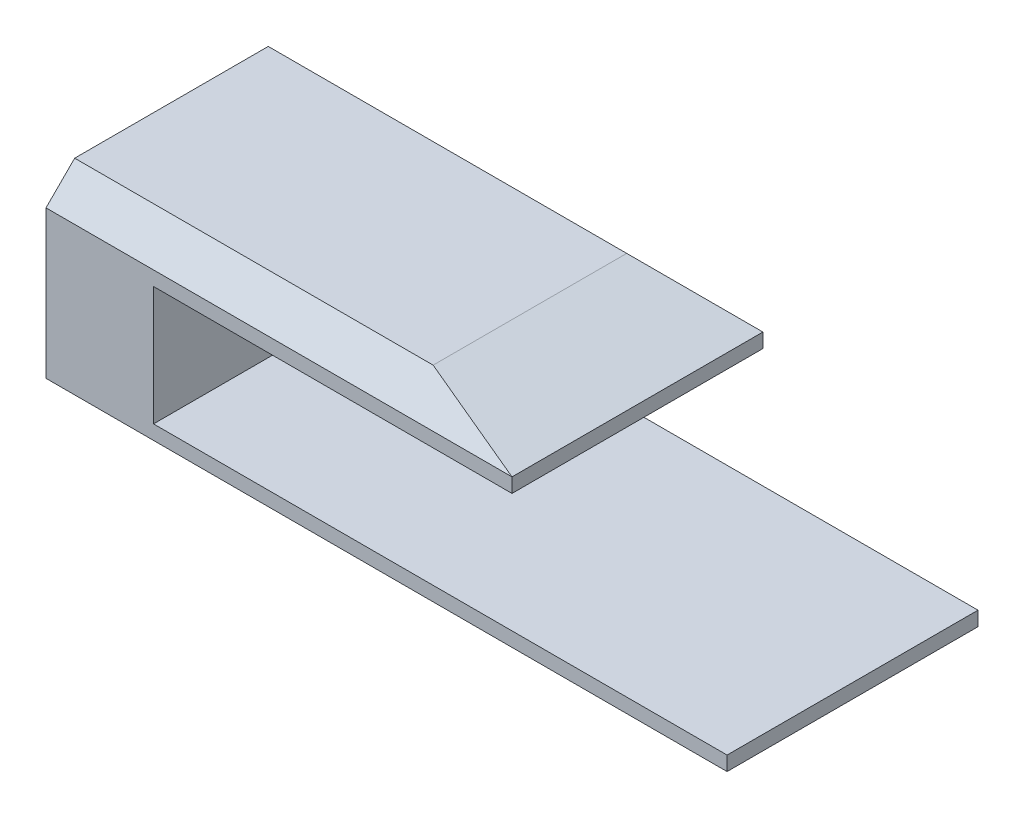
ISO-10303-21;
HEADER;
FILE_DESCRIPTION(('STEP AP214'),'2;1');
FILE_NAME('part.step','',(''),(''),'','','');
FILE_SCHEMA(('AUTOMOTIVE_DESIGN { 1 0 10303 214 1 1 1 1 }'));
ENDSEC;
DATA;
#1=APPLICATION_CONTEXT('core data for automotive mechanical design processes');
#2=APPLICATION_PROTOCOL_DEFINITION('international standard','automotive_design',2000,#1);
#3=PRODUCT_CONTEXT('',#1,'mechanical');
#4=PRODUCT('Part','Part','',(#3));
#5=PRODUCT_RELATED_PRODUCT_CATEGORY('part','',(#4));
#6=PRODUCT_DEFINITION_FORMATION('','',#4);
#7=PRODUCT_DEFINITION_CONTEXT('part definition',#1,'design');
#8=PRODUCT_DEFINITION('design','',#6,#7);
#9=PRODUCT_DEFINITION_SHAPE('','',#8);
#10=(LENGTH_UNIT() NAMED_UNIT(*) SI_UNIT(.MILLI.,.METRE.));
#11=(NAMED_UNIT(*) PLANE_ANGLE_UNIT() SI_UNIT($,.RADIAN.));
#12=(NAMED_UNIT(*) SI_UNIT($,.STERADIAN.) SOLID_ANGLE_UNIT());
#13=UNCERTAINTY_MEASURE_WITH_UNIT(LENGTH_MEASURE(1.E-05),#10,'distance_accuracy_value','');
#14=(GEOMETRIC_REPRESENTATION_CONTEXT(3) GLOBAL_UNCERTAINTY_ASSIGNED_CONTEXT((#13)) GLOBAL_UNIT_ASSIGNED_CONTEXT((#10,
#11,#12)) REPRESENTATION_CONTEXT('',''));
#15=CARTESIAN_POINT('',(0.,0.,0.));
#16=DIRECTION('',(0.,0.,1.));
#17=DIRECTION('',(1.,0.,0.));
#18=AXIS2_PLACEMENT_3D('',#15,#16,#17);
#19=CARTESIAN_POINT('',(0.,-28.6,35.));
#20=DIRECTION('',(1.,0.,0.));
#21=DIRECTION('',(0.,0.,-1.));
#22=AXIS2_PLACEMENT_3D('',#19,#20,#21);
#23=PLANE('',#22);
#24=DIRECTION('',(0.,-0.707106781186548,0.707106781186547));
#25=VECTOR('',#24,1.);
#26=CARTESIAN_POINT('',(0.,-14.3,6.89339828220179));
#27=LINE('',#26,#25);
#28=CARTESIAN_POINT('',(0.,-14.3,6.89339828220179));
#29=VERTEX_POINT('',#28);
#30=CARTESIAN_POINT('',(0.,-24.9066017177982,17.5));
#31=VERTEX_POINT('',#30);
#32=EDGE_CURVE('E181',#29,#31,#27,.T.);
#33=ORIENTED_EDGE('',*,*,#32,.F.);
#34=DIRECTION('',(0.,-0.707106781186547,-0.707106781186548));
#35=VECTOR('',#34,1.);
#36=CARTESIAN_POINT('',(0.,-3.69339828220179,17.5));
#37=LINE('',#36,#35);
#38=CARTESIAN_POINT('',(0.,-3.69339828220179,17.5));
#39=VERTEX_POINT('',#38);
#40=EDGE_CURVE('E155',#39,#29,#37,.T.);
#41=ORIENTED_EDGE('',*,*,#40,.F.);
#42=DIRECTION('',(0.,0.707106781186548,-0.707106781186548));
#43=VECTOR('',#42,1.);
#44=CARTESIAN_POINT('',(0.,-14.3,28.1066017177982));
#45=LINE('',#44,#43);
#46=CARTESIAN_POINT('',(0.,-14.3,28.1066017177982));
#47=VERTEX_POINT('',#46);
#48=EDGE_CURVE('E172',#47,#39,#45,.T.);
#49=ORIENTED_EDGE('',*,*,#48,.F.);
#50=DIRECTION('',(0.,0.707106781186547,0.707106781186547));
#51=VECTOR('',#50,1.);
#52=CARTESIAN_POINT('',(0.,-24.9066017177982,17.5));
#53=LINE('',#52,#51);
#54=EDGE_CURVE('E175',#31,#47,#53,.T.);
#55=ORIENTED_EDGE('',*,*,#54,.F.);
#56=EDGE_LOOP('',(#33,#41,#49,#55));
#57=FACE_BOUND('',#56,.T.);
#58=DIRECTION('',(0.,0.,-1.));
#59=VECTOR('',#58,1.);
#60=CARTESIAN_POINT('',(0.,-28.6,35.));
#61=LINE('',#60,#59);
#62=CARTESIAN_POINT('',(0.,-28.6,31.));
#63=VERTEX_POINT('',#62);
#64=CARTESIAN_POINT('',(0.,-28.6,4.00000000000002));
#65=VERTEX_POINT('',#64);
#66=EDGE_CURVE('E234',#63,#65,#61,.T.);
#67=ORIENTED_EDGE('',*,*,#66,.F.);
#68=DIRECTION('',(0.,-0.707106781186548,-0.707106781186548));
#69=VECTOR('',#68,1.);
#70=CARTESIAN_POINT('',(0.,-24.6,35.));
#71=LINE('',#70,#69);
#72=CARTESIAN_POINT('',(0.,-24.6,35.));
#73=VERTEX_POINT('',#72);
#74=EDGE_CURVE('E261',#63,#73,#71,.F.);
#75=ORIENTED_EDGE('',*,*,#74,.T.);
#76=DIRECTION('',(0.,-1.,0.));
#77=VECTOR('',#76,1.);
#78=CARTESIAN_POINT('',(0.,-28.6,35.));
#79=LINE('',#78,#77);
#80=CARTESIAN_POINT('',(0.,-4.00000000000002,35.));
#81=VERTEX_POINT('',#80);
#82=EDGE_CURVE('E192',#81,#73,#79,.T.);
#83=ORIENTED_EDGE('',*,*,#82,.F.);
#84=DIRECTION('',(0.,-0.707106781186548,0.707106781186548));
#85=VECTOR('',#84,1.);
#86=CARTESIAN_POINT('',(0.,-4.00000000000002,35.));
#87=LINE('',#86,#85);
#88=CARTESIAN_POINT('',(0.,0.,31.));
#89=VERTEX_POINT('',#88);
#90=EDGE_CURVE('E257',#81,#89,#87,.F.);
#91=ORIENTED_EDGE('',*,*,#90,.T.);
#92=DIRECTION('',(0.,0.,-1.));
#93=VECTOR('',#92,1.);
#94=CARTESIAN_POINT('',(0.,0.,35.));
#95=LINE('',#94,#93);
#96=CARTESIAN_POINT('',(0.,0.,4.00000000000002));
#97=VERTEX_POINT('',#96);
#98=EDGE_CURVE('E207',#89,#97,#95,.T.);
#99=ORIENTED_EDGE('',*,*,#98,.T.);
#100=DIRECTION('',(0.,-0.707106781186548,-0.707106781186548));
#101=VECTOR('',#100,1.);
#102=CARTESIAN_POINT('',(0.,0.,4.00000000000002));
#103=LINE('',#102,#101);
#104=CARTESIAN_POINT('',(0.,-4.00000000000002,0.));
#105=VERTEX_POINT('',#104);
#106=EDGE_CURVE('E255',#97,#105,#103,.T.);
#107=ORIENTED_EDGE('',*,*,#106,.T.);
#108=DIRECTION('',(0.,-1.,0.));
#109=VECTOR('',#108,1.);
#110=CARTESIAN_POINT('',(0.,-28.6,0.));
#111=LINE('',#110,#109);
#112=CARTESIAN_POINT('',(0.,-24.6,0.));
#113=VERTEX_POINT('',#112);
#114=EDGE_CURVE('E188',#105,#113,#111,.T.);
#115=ORIENTED_EDGE('',*,*,#114,.T.);
#116=DIRECTION('',(0.,-0.707106781186548,0.707106781186548));
#117=VECTOR('',#116,1.);
#118=CARTESIAN_POINT('',(0.,-28.6,4.00000000000001));
#119=LINE('',#118,#117);
#120=EDGE_CURVE('E259',#113,#65,#119,.T.);
#121=ORIENTED_EDGE('',*,*,#120,.T.);
#122=EDGE_LOOP('',(#67,#75,#83,#91,#99,#107,#115,#121));
#123=FACE_BOUND('',#122,.T.);
#124=ADVANCED_FACE('F35',(#57,#123),#23,.F.);
#125=CARTESIAN_POINT('',(95.,-28.6,35.));
#126=DIRECTION('',(0.,1.,0.));
#127=DIRECTION('',(-1.,0.,0.));
#128=AXIS2_PLACEMENT_3D('',#125,#126,#127);
#129=PLANE('',#128);
#130=DIRECTION('',(1.,0.,0.));
#131=VECTOR('',#130,1.);
#132=CARTESIAN_POINT('',(95.,-28.6,4.00000000000002));
#133=LINE('',#132,#131);
#134=CARTESIAN_POINT('',(79.9999999999998,-28.6,4.00000000000002));
#135=VERTEX_POINT('',#134);
#136=EDGE_CURVE('E251',#65,#135,#133,.T.);
#137=ORIENTED_EDGE('',*,*,#136,.T.);
#138=DIRECTION('',(0.,0.,1.));
#139=VECTOR('',#138,1.);
#140=CARTESIAN_POINT('',(79.9999999999998,-28.6,35.));
#141=LINE('',#140,#139);
#142=CARTESIAN_POINT('',(79.9999999999998,-28.6,31.));
#143=VERTEX_POINT('',#142);
#144=EDGE_CURVE('E44',#135,#143,#141,.T.);
#145=ORIENTED_EDGE('',*,*,#144,.T.);
#146=DIRECTION('',(-1.,0.,0.));
#147=VECTOR('',#146,1.);
#148=CARTESIAN_POINT('',(95.,-28.6,31.));
#149=LINE('',#148,#147);
#150=EDGE_CURVE('E253',#143,#63,#149,.T.);
#151=ORIENTED_EDGE('',*,*,#150,.T.);
#152=ORIENTED_EDGE('',*,*,#66,.T.);
#153=EDGE_LOOP('',(#137,#145,#151,#152));
#154=FACE_BOUND('',#153,.T.);
#155=ADVANCED_FACE('F303',(#154),#129,.F.);
#156=CARTESIAN_POINT('',(95.,-22.6,35.));
#157=DIRECTION('',(-1.,0.,0.));
#158=DIRECTION('',(0.,0.,1.));
#159=AXIS2_PLACEMENT_3D('',#156,#157,#158);
#160=PLANE('',#159);
#161=DIRECTION('',(0.,1.,0.));
#162=VECTOR('',#161,1.);
#163=CARTESIAN_POINT('',(95.,-22.6,35.));
#164=LINE('',#163,#162);
#165=CARTESIAN_POINT('',(95.,-24.6,35.));
#166=VERTEX_POINT('',#165);
#167=CARTESIAN_POINT('',(95.,-22.6,35.));
#168=VERTEX_POINT('',#167);
#169=EDGE_CURVE('E195',#166,#168,#164,.T.);
#170=ORIENTED_EDGE('',*,*,#169,.F.);
#171=DIRECTION('',(0.,0.,-1.));
#172=VECTOR('',#171,1.);
#173=CARTESIAN_POINT('',(95.,-24.6,35.));
#174=LINE('',#173,#172);
#175=CARTESIAN_POINT('',(95.,-24.6,0.));
#176=VERTEX_POINT('',#175);
#177=EDGE_CURVE('E282',#166,#176,#174,.T.);
#178=ORIENTED_EDGE('',*,*,#177,.T.);
#179=DIRECTION('',(0.,1.,0.));
#180=VECTOR('',#179,1.);
#181=CARTESIAN_POINT('',(95.,-22.6,0.));
#182=LINE('',#181,#180);
#183=CARTESIAN_POINT('',(95.,-22.6,0.));
#184=VERTEX_POINT('',#183);
#185=EDGE_CURVE('E210',#176,#184,#182,.T.);
#186=ORIENTED_EDGE('',*,*,#185,.T.);
#187=DIRECTION('',(0.,0.,-1.));
#188=VECTOR('',#187,1.);
#189=CARTESIAN_POINT('',(95.,-22.6,35.));
#190=LINE('',#189,#188);
#191=EDGE_CURVE('E231',#168,#184,#190,.T.);
#192=ORIENTED_EDGE('',*,*,#191,.F.);
#193=EDGE_LOOP('',(#170,#178,#186,#192));
#194=FACE_BOUND('',#193,.T.);
#195=ADVANCED_FACE('F289',(#194),#160,.F.);
#196=CARTESIAN_POINT('',(15.,-22.6,35.));
#197=DIRECTION('',(0.,-1.,0.));
#198=DIRECTION('',(0.,0.,-1.));
#199=AXIS2_PLACEMENT_3D('',#196,#197,#198);
#200=PLANE('',#199);
#201=DIRECTION('',(-1.,0.,0.));
#202=VECTOR('',#201,1.);
#203=CARTESIAN_POINT('',(15.,-22.6,0.));
#204=LINE('',#203,#202);
#205=CARTESIAN_POINT('',(15.,-22.6,0.));
#206=VERTEX_POINT('',#205);
#207=EDGE_CURVE('E212',#184,#206,#204,.T.);
#208=ORIENTED_EDGE('',*,*,#207,.T.);
#209=DIRECTION('',(0.,0.,-1.));
#210=VECTOR('',#209,1.);
#211=CARTESIAN_POINT('',(15.,-22.6,35.));
#212=LINE('',#211,#210);
#213=CARTESIAN_POINT('',(15.,-22.6,35.));
#214=VERTEX_POINT('',#213);
#215=EDGE_CURVE('E228',#214,#206,#212,.T.);
#216=ORIENTED_EDGE('',*,*,#215,.F.);
#217=DIRECTION('',(-1.,0.,0.));
#218=VECTOR('',#217,1.);
#219=CARTESIAN_POINT('',(15.,-22.6,35.));
#220=LINE('',#219,#218);
#221=EDGE_CURVE('E198',#168,#214,#220,.T.);
#222=ORIENTED_EDGE('',*,*,#221,.F.);
#223=ORIENTED_EDGE('',*,*,#191,.T.);
#224=EDGE_LOOP('',(#208,#216,#222,#223));
#225=FACE_BOUND('',#224,.T.);
#226=ADVANCED_FACE('F383',(#225),#200,.F.);
#227=CARTESIAN_POINT('',(15.,-5.99999999999999,35.));
#228=DIRECTION('',(-1.,0.,0.));
#229=DIRECTION('',(0.,-1.,0.));
#230=AXIS2_PLACEMENT_3D('',#227,#228,#229);
#231=PLANE('',#230);
#232=CARTESIAN_POINT('',(15.,-14.3,17.5));
#233=DIRECTION('',(-1.,0.,0.));
#234=DIRECTION('',(0.,-1.,0.));
#235=AXIS2_PLACEMENT_3D('',#232,#233,#234);
#236=CIRCLE('',#235,6.50000000000002);
#237=CARTESIAN_POINT('',(15.,-20.8,17.5));
#238=VERTEX_POINT('',#237);
#239=EDGE_CURVE('E242',#238,#238,#236,.T.);
#240=ORIENTED_EDGE('',*,*,#239,.T.);
#241=EDGE_LOOP('',(#240));
#242=FACE_BOUND('',#241,.T.);
#243=DIRECTION('',(0.,1.,0.));
#244=VECTOR('',#243,1.);
#245=CARTESIAN_POINT('',(15.,-5.99999999999999,0.));
#246=LINE('',#245,#244);
#247=CARTESIAN_POINT('',(15.,-5.99999999999999,0.));
#248=VERTEX_POINT('',#247);
#249=EDGE_CURVE('E214',#206,#248,#246,.T.);
#250=ORIENTED_EDGE('',*,*,#249,.T.);
#251=DIRECTION('',(0.,0.,-1.));
#252=VECTOR('',#251,1.);
#253=CARTESIAN_POINT('',(15.,-5.99999999999999,35.));
#254=LINE('',#253,#252);
#255=CARTESIAN_POINT('',(15.,-5.99999999999999,35.));
#256=VERTEX_POINT('',#255);
#257=EDGE_CURVE('E225',#256,#248,#254,.T.);
#258=ORIENTED_EDGE('',*,*,#257,.F.);
#259=DIRECTION('',(0.,1.,0.));
#260=VECTOR('',#259,1.);
#261=CARTESIAN_POINT('',(15.,-5.99999999999999,35.));
#262=LINE('',#261,#260);
#263=EDGE_CURVE('E200',#214,#256,#262,.T.);
#264=ORIENTED_EDGE('',*,*,#263,.F.);
#265=ORIENTED_EDGE('',*,*,#215,.T.);
#266=EDGE_LOOP('',(#250,#258,#264,#265));
#267=FACE_BOUND('',#266,.T.);
#268=ADVANCED_FACE('F387',(#242,#267),#231,.F.);
#269=CARTESIAN_POINT('',(65.,-5.99999999999999,35.));
#270=DIRECTION('',(0.,1.,0.));
#271=DIRECTION('',(0.,0.,1.));
#272=AXIS2_PLACEMENT_3D('',#269,#270,#271);
#273=PLANE('',#272);
#274=DIRECTION('',(1.,0.,0.));
#275=VECTOR('',#274,1.);
#276=CARTESIAN_POINT('',(65.,-5.99999999999999,0.));
#277=LINE('',#276,#275);
#278=CARTESIAN_POINT('',(65.,-5.99999999999999,0.));
#279=VERTEX_POINT('',#278);
#280=EDGE_CURVE('E216',#248,#279,#277,.T.);
#281=ORIENTED_EDGE('',*,*,#280,.T.);
#282=DIRECTION('',(0.,0.,-1.));
#283=VECTOR('',#282,1.);
#284=CARTESIAN_POINT('',(65.,-5.99999999999999,35.));
#285=LINE('',#284,#283);
#286=CARTESIAN_POINT('',(65.,-5.99999999999999,35.));
#287=VERTEX_POINT('',#286);
#288=EDGE_CURVE('E222',#287,#279,#285,.T.);
#289=ORIENTED_EDGE('',*,*,#288,.F.);
#290=DIRECTION('',(1.,0.,0.));
#291=VECTOR('',#290,1.);
#292=CARTESIAN_POINT('',(65.,-5.99999999999999,35.));
#293=LINE('',#292,#291);
#294=EDGE_CURVE('E202',#256,#287,#293,.T.);
#295=ORIENTED_EDGE('',*,*,#294,.F.);
#296=ORIENTED_EDGE('',*,*,#257,.T.);
#297=EDGE_LOOP('',(#281,#289,#295,#296));
#298=FACE_BOUND('',#297,.T.);
#299=ADVANCED_FACE('F390',(#298),#273,.F.);
#300=CARTESIAN_POINT('',(65.,0.,35.));
#301=DIRECTION('',(-1.,0.,0.));
#302=DIRECTION('',(0.,0.,1.));
#303=AXIS2_PLACEMENT_3D('',#300,#301,#302);
#304=PLANE('',#303);
#305=DIRECTION('',(0.,1.,0.));
#306=VECTOR('',#305,1.);
#307=CARTESIAN_POINT('',(65.,0.,0.));
#308=LINE('',#307,#306);
#309=CARTESIAN_POINT('',(65.,-4.00000000000002,0.));
#310=VERTEX_POINT('',#309);
#311=EDGE_CURVE('E196',#279,#310,#308,.T.);
#312=ORIENTED_EDGE('',*,*,#311,.T.);
#313=DIRECTION('',(0.,0.,1.));
#314=VECTOR('',#313,1.);
#315=CARTESIAN_POINT('',(65.,-4.00000000000001,35.));
#316=LINE('',#315,#314);
#317=CARTESIAN_POINT('',(65.,-4.00000000000002,35.));
#318=VERTEX_POINT('',#317);
#319=EDGE_CURVE('E278',#310,#318,#316,.T.);
#320=ORIENTED_EDGE('',*,*,#319,.T.);
#321=DIRECTION('',(0.,1.,0.));
#322=VECTOR('',#321,1.);
#323=CARTESIAN_POINT('',(65.,0.,35.));
#324=LINE('',#323,#322);
#325=EDGE_CURVE('E204',#287,#318,#324,.T.);
#326=ORIENTED_EDGE('',*,*,#325,.F.);
#327=ORIENTED_EDGE('',*,*,#288,.T.);
#328=EDGE_LOOP('',(#312,#320,#326,#327));
#329=FACE_BOUND('',#328,.T.);
#330=ADVANCED_FACE('F372',(#329),#304,.F.);
#331=CARTESIAN_POINT('',(0.,0.,35.));
#332=DIRECTION('',(0.,-1.,0.));
#333=DIRECTION('',(0.,0.,-1.));
#334=AXIS2_PLACEMENT_3D('',#331,#332,#333);
#335=PLANE('',#334);
#336=DIRECTION('',(1.,0.,0.));
#337=VECTOR('',#336,1.);
#338=CARTESIAN_POINT('',(0.,0.,31.));
#339=LINE('',#338,#337);
#340=CARTESIAN_POINT('',(49.9999999999998,0.,31.));
#341=VERTEX_POINT('',#340);
#342=EDGE_CURVE('E270',#89,#341,#339,.T.);
#343=ORIENTED_EDGE('',*,*,#342,.T.);
#344=DIRECTION('',(0.,0.,-1.));
#345=VECTOR('',#344,1.);
#346=CARTESIAN_POINT('',(49.9999999999998,0.,35.));
#347=LINE('',#346,#345);
#348=CARTESIAN_POINT('',(49.9999999999998,0.,4.00000000000002));
#349=VERTEX_POINT('',#348);
#350=EDGE_CURVE('E273',#341,#349,#347,.T.);
#351=ORIENTED_EDGE('',*,*,#350,.T.);
#352=DIRECTION('',(-1.,0.,0.));
#353=VECTOR('',#352,1.);
#354=CARTESIAN_POINT('',(0.,0.,4.00000000000002));
#355=LINE('',#354,#353);
#356=EDGE_CURVE('E268',#349,#97,#355,.T.);
#357=ORIENTED_EDGE('',*,*,#356,.T.);
#358=ORIENTED_EDGE('',*,*,#98,.F.);
#359=EDGE_LOOP('',(#343,#351,#357,#358));
#360=FACE_BOUND('',#359,.T.);
#361=ADVANCED_FACE('F365',(#360),#335,.F.);
#362=CARTESIAN_POINT('',(0.,0.,35.));
#363=DIRECTION('',(0.,0.,-1.));
#364=DIRECTION('',(-1.,0.,0.));
#365=AXIS2_PLACEMENT_3D('',#362,#363,#364);
#366=PLANE('',#365);
#367=ORIENTED_EDGE('',*,*,#82,.T.);
#368=DIRECTION('',(1.,0.,0.));
#369=VECTOR('',#368,1.);
#370=CARTESIAN_POINT('',(0.,-24.6,35.));
#371=LINE('',#370,#369);
#372=EDGE_CURVE('E248',#73,#166,#371,.T.);
#373=ORIENTED_EDGE('',*,*,#372,.T.);
#374=ORIENTED_EDGE('',*,*,#169,.T.);
#375=ORIENTED_EDGE('',*,*,#221,.T.);
#376=ORIENTED_EDGE('',*,*,#263,.T.);
#377=ORIENTED_EDGE('',*,*,#294,.T.);
#378=ORIENTED_EDGE('',*,*,#325,.T.);
#379=DIRECTION('',(-1.,0.,0.));
#380=VECTOR('',#379,1.);
#381=CARTESIAN_POINT('',(0.,-4.00000000000002,35.));
#382=LINE('',#381,#380);
#383=EDGE_CURVE('E245',#318,#81,#382,.T.);
#384=ORIENTED_EDGE('',*,*,#383,.T.);
#385=EDGE_LOOP('',(#367,#373,#374,#375,#376,#377,#378,#384));
#386=FACE_BOUND('',#385,.T.);
#387=ADVANCED_FACE('F376',(#386),#366,.F.);
#388=CARTESIAN_POINT('',(0.,0.,0.));
#389=DIRECTION('',(0.,0.,-1.));
#390=DIRECTION('',(-1.,0.,0.));
#391=AXIS2_PLACEMENT_3D('',#388,#389,#390);
#392=PLANE('',#391);
#393=ORIENTED_EDGE('',*,*,#185,.F.);
#394=DIRECTION('',(-1.,0.,0.));
#395=VECTOR('',#394,1.);
#396=CARTESIAN_POINT('',(0.,-24.6,0.));
#397=LINE('',#396,#395);
#398=EDGE_CURVE('E266',#176,#113,#397,.T.);
#399=ORIENTED_EDGE('',*,*,#398,.T.);
#400=ORIENTED_EDGE('',*,*,#114,.F.);
#401=DIRECTION('',(1.,0.,0.));
#402=VECTOR('',#401,1.);
#403=CARTESIAN_POINT('',(65.,-4.00000000000002,0.));
#404=LINE('',#403,#402);
#405=EDGE_CURVE('E263',#105,#310,#404,.T.);
#406=ORIENTED_EDGE('',*,*,#405,.T.);
#407=ORIENTED_EDGE('',*,*,#311,.F.);
#408=ORIENTED_EDGE('',*,*,#280,.F.);
#409=ORIENTED_EDGE('',*,*,#249,.F.);
#410=ORIENTED_EDGE('',*,*,#207,.F.);
#411=EDGE_LOOP('',(#393,#399,#400,#406,#407,#408,#409,#410));
#412=FACE_BOUND('',#411,.T.);
#413=ADVANCED_FACE('F295',(#412),#392,.T.);
#414=CARTESIAN_POINT('',(3.,-3.69339828220179,17.5));
#415=DIRECTION('',(0.,0.707106781186548,-0.707106781186547));
#416=DIRECTION('',(0.,0.707106781186547,0.707106781186548));
#417=AXIS2_PLACEMENT_3D('',#414,#415,#416);
#418=PLANE('',#417);
#419=ORIENTED_EDGE('',*,*,#40,.T.);
#420=DIRECTION('',(-1.,0.,0.));
#421=VECTOR('',#420,1.);
#422=CARTESIAN_POINT('',(3.,-14.3,6.89339828220179));
#423=LINE('',#422,#421);
#424=CARTESIAN_POINT('',(3.,-14.3,6.89339828220179));
#425=VERTEX_POINT('',#424);
#426=EDGE_CURVE('E148',#425,#29,#423,.T.);
#427=ORIENTED_EDGE('',*,*,#426,.F.);
#428=DIRECTION('',(0.,-0.707106781186547,-0.707106781186548));
#429=VECTOR('',#428,1.);
#430=CARTESIAN_POINT('',(3.,-3.69339828220179,17.5));
#431=LINE('',#430,#429);
#432=CARTESIAN_POINT('',(3.,-3.69339828220179,17.5));
#433=VERTEX_POINT('',#432);
#434=EDGE_CURVE('E152',#433,#425,#431,.T.);
#435=ORIENTED_EDGE('',*,*,#434,.F.);
#436=DIRECTION('',(-1.,0.,0.));
#437=VECTOR('',#436,1.);
#438=CARTESIAN_POINT('',(3.,-3.69339828220179,17.5));
#439=LINE('',#438,#437);
#440=EDGE_CURVE('E186',#433,#39,#439,.T.);
#441=ORIENTED_EDGE('',*,*,#440,.T.);
#442=EDGE_LOOP('',(#419,#427,#435,#441));
#443=FACE_BOUND('',#442,.T.);
#444=ADVANCED_FACE('F150',(#443),#418,.F.);
#445=CARTESIAN_POINT('',(3.,-14.3,28.1066017177982));
#446=DIRECTION('',(0.,0.707106781186547,0.707106781186547));
#447=DIRECTION('',(0.,-0.707106781186548,0.707106781186548));
#448=AXIS2_PLACEMENT_3D('',#445,#446,#447);
#449=PLANE('',#448);
#450=ORIENTED_EDGE('',*,*,#48,.T.);
#451=ORIENTED_EDGE('',*,*,#440,.F.);
#452=DIRECTION('',(0.,0.707106781186548,-0.707106781186548));
#453=VECTOR('',#452,1.);
#454=CARTESIAN_POINT('',(3.,-14.3,28.1066017177982));
#455=LINE('',#454,#453);
#456=CARTESIAN_POINT('',(3.,-14.3,28.1066017177982));
#457=VERTEX_POINT('',#456);
#458=EDGE_CURVE('E160',#457,#433,#455,.T.);
#459=ORIENTED_EDGE('',*,*,#458,.F.);
#460=DIRECTION('',(-1.,0.,0.));
#461=VECTOR('',#460,1.);
#462=CARTESIAN_POINT('',(3.,-14.3,28.1066017177982));
#463=LINE('',#462,#461);
#464=EDGE_CURVE('E189',#457,#47,#463,.T.);
#465=ORIENTED_EDGE('',*,*,#464,.T.);
#466=EDGE_LOOP('',(#450,#451,#459,#465));
#467=FACE_BOUND('',#466,.T.);
#468=ADVANCED_FACE('F518',(#467),#449,.F.);
#469=CARTESIAN_POINT('',(3.,-24.9066017177982,17.5));
#470=DIRECTION('',(0.,-0.707106781186548,0.707106781186548));
#471=DIRECTION('',(0.,-0.707106781186548,-0.707106781186548));
#472=AXIS2_PLACEMENT_3D('',#469,#470,#471);
#473=PLANE('',#472);
#474=ORIENTED_EDGE('',*,*,#54,.T.);
#475=ORIENTED_EDGE('',*,*,#464,.F.);
#476=DIRECTION('',(0.,0.707106781186547,0.707106781186547));
#477=VECTOR('',#476,1.);
#478=CARTESIAN_POINT('',(3.,-24.9066017177982,17.5));
#479=LINE('',#478,#477);
#480=CARTESIAN_POINT('',(3.,-24.9066017177982,17.5));
#481=VERTEX_POINT('',#480);
#482=EDGE_CURVE('E168',#481,#457,#479,.T.);
#483=ORIENTED_EDGE('',*,*,#482,.F.);
#484=DIRECTION('',(-1.,0.,0.));
#485=VECTOR('',#484,1.);
#486=CARTESIAN_POINT('',(3.,-24.9066017177982,17.5));
#487=LINE('',#486,#485);
#488=EDGE_CURVE('E159',#481,#31,#487,.T.);
#489=ORIENTED_EDGE('',*,*,#488,.T.);
#490=EDGE_LOOP('',(#474,#475,#483,#489));
#491=FACE_BOUND('',#490,.T.);
#492=ADVANCED_FACE('F521',(#491),#473,.F.);
#493=CARTESIAN_POINT('',(3.,-14.3,6.89339828220179));
#494=DIRECTION('',(0.,-0.707106781186547,-0.707106781186548));
#495=DIRECTION('',(0.,0.707106781186548,-0.707106781186547));
#496=AXIS2_PLACEMENT_3D('',#493,#494,#495);
#497=PLANE('',#496);
#498=ORIENTED_EDGE('',*,*,#32,.T.);
#499=ORIENTED_EDGE('',*,*,#488,.F.);
#500=DIRECTION('',(0.,-0.707106781186548,0.707106781186547));
#501=VECTOR('',#500,1.);
#502=CARTESIAN_POINT('',(3.,-14.3,6.89339828220179));
#503=LINE('',#502,#501);
#504=EDGE_CURVE('E163',#425,#481,#503,.T.);
#505=ORIENTED_EDGE('',*,*,#504,.F.);
#506=ORIENTED_EDGE('',*,*,#426,.T.);
#507=EDGE_LOOP('',(#498,#499,#505,#506));
#508=FACE_BOUND('',#507,.T.);
#509=ADVANCED_FACE('F164',(#508),#497,.F.);
#510=CARTESIAN_POINT('',(3.,0.,0.));
#511=DIRECTION('',(-1.,0.,0.));
#512=DIRECTION('',(0.,-1.,0.));
#513=AXIS2_PLACEMENT_3D('',#510,#511,#512);
#514=PLANE('',#513);
#515=CARTESIAN_POINT('',(3.,-14.3,17.5));
#516=DIRECTION('',(-1.,0.,0.));
#517=DIRECTION('',(0.,-1.,0.));
#518=AXIS2_PLACEMENT_3D('',#515,#516,#517);
#519=CIRCLE('',#518,2.5);
#520=CARTESIAN_POINT('',(3.,-16.8,17.5));
#521=VERTEX_POINT('',#520);
#522=EDGE_CURVE('E182',#521,#521,#519,.T.);
#523=ORIENTED_EDGE('',*,*,#522,.F.);
#524=EDGE_LOOP('',(#523));
#525=FACE_BOUND('',#524,.T.);
#526=ORIENTED_EDGE('',*,*,#434,.T.);
#527=ORIENTED_EDGE('',*,*,#504,.T.);
#528=ORIENTED_EDGE('',*,*,#482,.T.);
#529=ORIENTED_EDGE('',*,*,#458,.T.);
#530=EDGE_LOOP('',(#526,#527,#528,#529));
#531=FACE_BOUND('',#530,.T.);
#532=ADVANCED_FACE('F170',(#525,#531),#514,.T.);
#533=CARTESIAN_POINT('',(22.0710678118655,-14.3,17.5));
#534=DIRECTION('',(-1.,0.,0.));
#535=DIRECTION('',(0.,-1.,0.));
#536=AXIS2_PLACEMENT_3D('',#533,#534,#535);
#537=CYLINDRICAL_SURFACE('',#536,2.5);
#538=CARTESIAN_POINT('',(11.,-14.3,17.5));
#539=DIRECTION('',(-1.,0.,0.));
#540=DIRECTION('',(0.,0.,1.));
#541=AXIS2_PLACEMENT_3D('',#538,#539,#540);
#542=CIRCLE('',#541,2.5);
#543=CARTESIAN_POINT('',(11.,-14.3,20.));
#544=VERTEX_POINT('',#543);
#545=EDGE_CURVE('E237',#544,#544,#542,.F.);
#546=ORIENTED_EDGE('',*,*,#545,.T.);
#547=EDGE_LOOP('',(#546));
#548=FACE_BOUND('',#547,.T.);
#549=ORIENTED_EDGE('',*,*,#522,.T.);
#550=EDGE_LOOP('',(#549));
#551=FACE_BOUND('',#550,.T.);
#552=ADVANCED_FACE('F330',(#548,#551),#537,.F.);
#553=CARTESIAN_POINT('',(11.,-14.3,17.5));
#554=DIRECTION('',(1.,0.,0.));
#555=DIRECTION('',(0.,0.,-1.));
#556=AXIS2_PLACEMENT_3D('',#553,#554,#555);
#557=CONICAL_SURFACE('',#556,2.5,0.78539816339745);
#558=ORIENTED_EDGE('',*,*,#239,.F.);
#559=EDGE_LOOP('',(#558));
#560=FACE_BOUND('',#559,.T.);
#561=ORIENTED_EDGE('',*,*,#545,.F.);
#562=EDGE_LOOP('',(#561));
#563=FACE_BOUND('',#562,.T.);
#564=ADVANCED_FACE('F324',(#560,#563),#557,.F.);
#565=CARTESIAN_POINT('',(0.,-24.6,35.));
#566=DIRECTION('',(0.,0.707106781186548,-0.707106781186548));
#567=DIRECTION('',(1.,0.,0.));
#568=AXIS2_PLACEMENT_3D('',#565,#566,#567);
#569=PLANE('',#568);
#570=ORIENTED_EDGE('',*,*,#150,.F.);
#571=DIRECTION('',(0.935674292327709,0.249513144620719,0.249513144620719));
#572=VECTOR('',#571,1.);
#573=CARTESIAN_POINT('',(11.8287937743188,-46.778988326848,12.821011673152));
#574=LINE('',#573,#572);
#575=EDGE_CURVE('E11',#143,#166,#574,.T.);
#576=ORIENTED_EDGE('',*,*,#575,.T.);
#577=ORIENTED_EDGE('',*,*,#372,.F.);
#578=ORIENTED_EDGE('',*,*,#74,.F.);
#579=EDGE_LOOP('',(#570,#576,#577,#578));
#580=FACE_BOUND('',#579,.T.);
#581=ADVANCED_FACE('F305',(#580),#569,.F.);
#582=CARTESIAN_POINT('',(95.,-28.6,4.00000000000002));
#583=DIRECTION('',(0.,-0.707106781186548,-0.707106781186548));
#584=DIRECTION('',(-1.,0.,0.));
#585=AXIS2_PLACEMENT_3D('',#582,#583,#584);
#586=PLANE('',#585);
#587=ORIENTED_EDGE('',*,*,#398,.F.);
#588=DIRECTION('',(0.935674292327709,0.249513144620719,-0.249513144620719));
#589=VECTOR('',#588,1.);
#590=CARTESIAN_POINT('',(93.1322957198444,-25.0980544747081,0.498054474708175));
#591=LINE('',#590,#589);
#592=EDGE_CURVE('E58',#176,#135,#591,.F.);
#593=ORIENTED_EDGE('',*,*,#592,.T.);
#594=ORIENTED_EDGE('',*,*,#136,.F.);
#595=ORIENTED_EDGE('',*,*,#120,.F.);
#596=EDGE_LOOP('',(#587,#593,#594,#595));
#597=FACE_BOUND('',#596,.T.);
#598=ADVANCED_FACE('F299',(#597),#586,.T.);
#599=CARTESIAN_POINT('',(0.,-4.00000000000002,35.));
#600=DIRECTION('',(0.,-0.707106781186548,-0.707106781186548));
#601=DIRECTION('',(-1.,0.,0.));
#602=AXIS2_PLACEMENT_3D('',#599,#600,#601);
#603=PLANE('',#602);
#604=ORIENTED_EDGE('',*,*,#383,.F.);
#605=DIRECTION('',(-0.935674292327709,0.24951314462072,-0.24951314462072));
#606=VECTOR('',#605,1.);
#607=CARTESIAN_POINT('',(8.09338521400763,11.1750972762645,19.8249027237355));
#608=LINE('',#607,#606);
#609=EDGE_CURVE('E280',#318,#341,#608,.T.);
#610=ORIENTED_EDGE('',*,*,#609,.T.);
#611=ORIENTED_EDGE('',*,*,#342,.F.);
#612=ORIENTED_EDGE('',*,*,#90,.F.);
#613=EDGE_LOOP('',(#604,#610,#611,#612));
#614=FACE_BOUND('',#613,.T.);
#615=ADVANCED_FACE('F342',(#614),#603,.F.);
#616=CARTESIAN_POINT('',(0.,0.,4.00000000000002));
#617=DIRECTION('',(0.,0.707106781186548,-0.707106781186548));
#618=DIRECTION('',(1.,0.,0.));
#619=AXIS2_PLACEMENT_3D('',#616,#617,#618);
#620=PLANE('',#619);
#621=ORIENTED_EDGE('',*,*,#356,.F.);
#622=DIRECTION('',(-0.935674292327709,0.24951314462072,0.24951314462072));
#623=VECTOR('',#622,1.);
#624=CARTESIAN_POINT('',(6.22568093385199,11.6731517509726,15.6731517509726));
#625=LINE('',#624,#623);
#626=EDGE_CURVE('E276',#349,#310,#625,.F.);
#627=ORIENTED_EDGE('',*,*,#626,.T.);
#628=ORIENTED_EDGE('',*,*,#405,.F.);
#629=ORIENTED_EDGE('',*,*,#106,.F.);
#630=EDGE_LOOP('',(#621,#627,#628,#629));
#631=FACE_BOUND('',#630,.T.);
#632=ADVANCED_FACE('F312',(#631),#620,.T.);
#633=CARTESIAN_POINT('',(49.9999999999998,0.,35.));
#634=DIRECTION('',(-0.25766265056033,-0.966234939601247,0.));
#635=DIRECTION('',(0.,0.,-1.));
#636=AXIS2_PLACEMENT_3D('',#633,#634,#635);
#637=PLANE('',#636);
#638=ORIENTED_EDGE('',*,*,#609,.F.);
#639=ORIENTED_EDGE('',*,*,#319,.F.);
#640=ORIENTED_EDGE('',*,*,#626,.F.);
#641=ORIENTED_EDGE('',*,*,#350,.F.);
#642=EDGE_LOOP('',(#638,#639,#640,#641));
#643=FACE_BOUND('',#642,.T.);
#644=ADVANCED_FACE('F308',(#643),#637,.F.);
#645=CARTESIAN_POINT('',(95.,-24.6,35.));
#646=DIRECTION('',(-0.257662650560329,0.966234939601247,0.));
#647=DIRECTION('',(0.,0.,-1.));
#648=AXIS2_PLACEMENT_3D('',#645,#646,#647);
#649=PLANE('',#648);
#650=ORIENTED_EDGE('',*,*,#575,.F.);
#651=ORIENTED_EDGE('',*,*,#144,.F.);
#652=ORIENTED_EDGE('',*,*,#592,.F.);
#653=ORIENTED_EDGE('',*,*,#177,.F.);
#654=EDGE_LOOP('',(#650,#651,#652,#653));
#655=FACE_BOUND('',#654,.T.);
#656=ADVANCED_FACE('F38',(#655),#649,.F.);
#657=CLOSED_SHELL('',(#124,#155,#195,#226,#268,#299,#330,#361,#387,#413,#444,#468,#492,#509,
#532,#552,#564,#581,#598,#615,#632,#644,#656));
#658=MANIFOLD_SOLID_BREP('B2',#657);
#659=ADVANCED_BREP_SHAPE_REPRESENTATION('',(#18,#658),#14);
#660=SHAPE_DEFINITION_REPRESENTATION(#9,#659);
ENDSEC;
END-ISO-10303-21;
